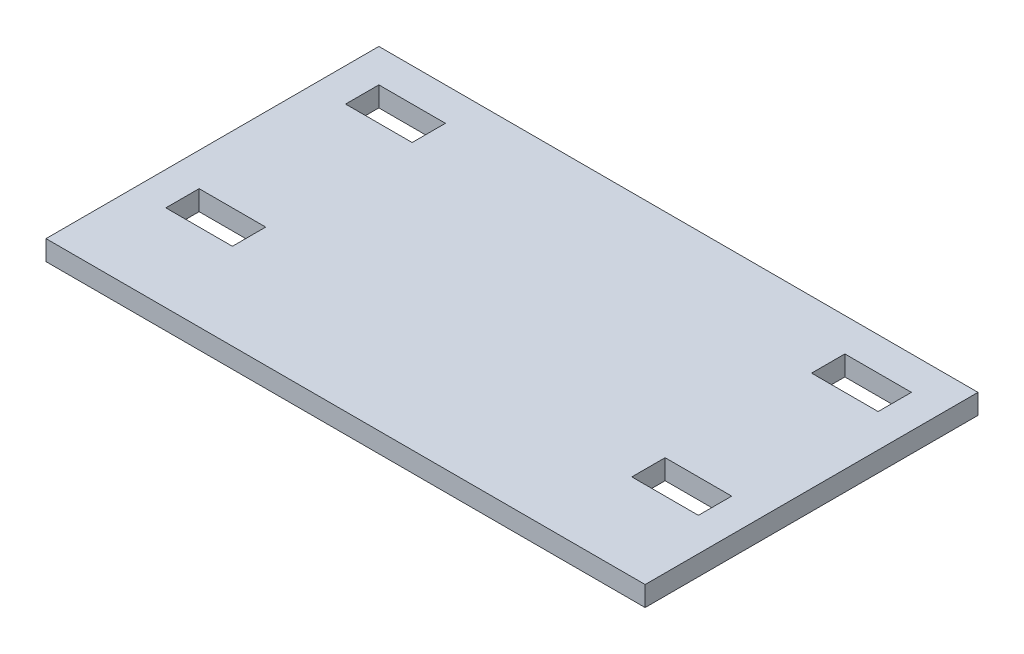
ISO-10303-21;
HEADER;
FILE_DESCRIPTION(('STEP AP214'),'2;1');
FILE_NAME('part.step','',(''),(''),'','','');
FILE_SCHEMA(('AUTOMOTIVE_DESIGN { 1 0 10303 214 1 1 1 1 }'));
ENDSEC;
DATA;
#1=APPLICATION_CONTEXT('core data for automotive mechanical design processes');
#2=APPLICATION_PROTOCOL_DEFINITION('international standard','automotive_design',2000,#1);
#3=PRODUCT_CONTEXT('',#1,'mechanical');
#4=PRODUCT('Part','Part','',(#3));
#5=PRODUCT_RELATED_PRODUCT_CATEGORY('part','',(#4));
#6=PRODUCT_DEFINITION_FORMATION('','',#4);
#7=PRODUCT_DEFINITION_CONTEXT('part definition',#1,'design');
#8=PRODUCT_DEFINITION('design','',#6,#7);
#9=PRODUCT_DEFINITION_SHAPE('','',#8);
#10=(LENGTH_UNIT() NAMED_UNIT(*) SI_UNIT(.MILLI.,.METRE.));
#11=(NAMED_UNIT(*) PLANE_ANGLE_UNIT() SI_UNIT($,.RADIAN.));
#12=(NAMED_UNIT(*) SI_UNIT($,.STERADIAN.) SOLID_ANGLE_UNIT());
#13=UNCERTAINTY_MEASURE_WITH_UNIT(LENGTH_MEASURE(1.E-05),#10,'distance_accuracy_value','');
#14=(GEOMETRIC_REPRESENTATION_CONTEXT(3) GLOBAL_UNCERTAINTY_ASSIGNED_CONTEXT((#13)) GLOBAL_UNIT_ASSIGNED_CONTEXT((#10,
#11,#12)) REPRESENTATION_CONTEXT('',''));
#15=CARTESIAN_POINT('',(0.,0.,0.));
#16=DIRECTION('',(0.,0.,1.));
#17=DIRECTION('',(1.,0.,0.));
#18=AXIS2_PLACEMENT_3D('',#15,#16,#17);
#19=CARTESIAN_POINT('',(-45.,3.,25.));
#20=DIRECTION('',(-1.,0.,0.));
#21=DIRECTION('',(0.,0.,1.));
#22=AXIS2_PLACEMENT_3D('',#19,#20,#21);
#23=PLANE('',#22);
#24=DIRECTION('',(0.,0.,-1.));
#25=VECTOR('',#24,1.);
#26=CARTESIAN_POINT('',(-45.,0.,25.));
#27=LINE('',#26,#25);
#28=CARTESIAN_POINT('',(-45.,0.,25.));
#29=VERTEX_POINT('',#28);
#30=CARTESIAN_POINT('',(-45.,0.,-25.));
#31=VERTEX_POINT('',#30);
#32=EDGE_CURVE('E303',#29,#31,#27,.T.);
#33=ORIENTED_EDGE('',*,*,#32,.F.);
#34=DIRECTION('',(0.,-1.,0.));
#35=VECTOR('',#34,1.);
#36=CARTESIAN_POINT('',(-45.,3.,25.));
#37=LINE('',#36,#35);
#38=CARTESIAN_POINT('',(-45.,3.,25.));
#39=VERTEX_POINT('',#38);
#40=EDGE_CURVE('E11',#39,#29,#37,.T.);
#41=ORIENTED_EDGE('',*,*,#40,.F.);
#42=DIRECTION('',(0.,0.,-1.));
#43=VECTOR('',#42,1.);
#44=CARTESIAN_POINT('',(-45.,3.,25.));
#45=LINE('',#44,#43);
#46=CARTESIAN_POINT('',(-45.,3.,-25.));
#47=VERTEX_POINT('',#46);
#48=EDGE_CURVE('E304',#39,#47,#45,.T.);
#49=ORIENTED_EDGE('',*,*,#48,.T.);
#50=DIRECTION('',(0.,-1.,0.));
#51=VECTOR('',#50,1.);
#52=CARTESIAN_POINT('',(-45.,3.,-25.));
#53=LINE('',#52,#51);
#54=EDGE_CURVE('E36',#47,#31,#53,.T.);
#55=ORIENTED_EDGE('',*,*,#54,.T.);
#56=EDGE_LOOP('',(#33,#41,#49,#55));
#57=FACE_BOUND('',#56,.T.);
#58=ADVANCED_FACE('F33',(#57),#23,.T.);
#59=CARTESIAN_POINT('',(-45.,3.,25.));
#60=DIRECTION('',(0.,0.,-1.));
#61=DIRECTION('',(-1.,0.,0.));
#62=AXIS2_PLACEMENT_3D('',#59,#60,#61);
#63=PLANE('',#62);
#64=DIRECTION('',(1.,0.,0.));
#65=VECTOR('',#64,1.);
#66=CARTESIAN_POINT('',(-45.,0.,25.));
#67=LINE('',#66,#65);
#68=CARTESIAN_POINT('',(45.,0.,25.));
#69=VERTEX_POINT('',#68);
#70=EDGE_CURVE('E308',#29,#69,#67,.T.);
#71=ORIENTED_EDGE('',*,*,#70,.T.);
#72=DIRECTION('',(0.,-1.,0.));
#73=VECTOR('',#72,1.);
#74=CARTESIAN_POINT('',(45.,3.,25.));
#75=LINE('',#74,#73);
#76=CARTESIAN_POINT('',(45.,3.,25.));
#77=VERTEX_POINT('',#76);
#78=EDGE_CURVE('E41',#77,#69,#75,.T.);
#79=ORIENTED_EDGE('',*,*,#78,.F.);
#80=DIRECTION('',(1.,0.,0.));
#81=VECTOR('',#80,1.);
#82=CARTESIAN_POINT('',(-45.,3.,25.));
#83=LINE('',#82,#81);
#84=EDGE_CURVE('E313',#39,#77,#83,.T.);
#85=ORIENTED_EDGE('',*,*,#84,.F.);
#86=ORIENTED_EDGE('',*,*,#40,.T.);
#87=EDGE_LOOP('',(#71,#79,#85,#86));
#88=FACE_BOUND('',#87,.T.);
#89=ADVANCED_FACE('F339',(#88),#63,.F.);
#90=CARTESIAN_POINT('',(45.,3.,25.));
#91=DIRECTION('',(-1.,0.,0.));
#92=DIRECTION('',(0.,0.,1.));
#93=AXIS2_PLACEMENT_3D('',#90,#91,#92);
#94=PLANE('',#93);
#95=DIRECTION('',(0.,0.,-1.));
#96=VECTOR('',#95,1.);
#97=CARTESIAN_POINT('',(45.,0.,25.));
#98=LINE('',#97,#96);
#99=CARTESIAN_POINT('',(45.,0.,-25.));
#100=VERTEX_POINT('',#99);
#101=EDGE_CURVE('E320',#69,#100,#98,.T.);
#102=ORIENTED_EDGE('',*,*,#101,.T.);
#103=DIRECTION('',(0.,-1.,0.));
#104=VECTOR('',#103,1.);
#105=CARTESIAN_POINT('',(45.,3.,-25.));
#106=LINE('',#105,#104);
#107=CARTESIAN_POINT('',(45.,3.,-25.));
#108=VERTEX_POINT('',#107);
#109=EDGE_CURVE('E325',#108,#100,#106,.T.);
#110=ORIENTED_EDGE('',*,*,#109,.F.);
#111=DIRECTION('',(0.,0.,-1.));
#112=VECTOR('',#111,1.);
#113=CARTESIAN_POINT('',(45.,3.,25.));
#114=LINE('',#113,#112);
#115=EDGE_CURVE('E311',#77,#108,#114,.T.);
#116=ORIENTED_EDGE('',*,*,#115,.F.);
#117=ORIENTED_EDGE('',*,*,#78,.T.);
#118=EDGE_LOOP('',(#102,#110,#116,#117));
#119=FACE_BOUND('',#118,.T.);
#120=ADVANCED_FACE('F343',(#119),#94,.F.);
#121=CARTESIAN_POINT('',(-45.,3.,-25.));
#122=DIRECTION('',(0.,0.,-1.));
#123=DIRECTION('',(-1.,0.,0.));
#124=AXIS2_PLACEMENT_3D('',#121,#122,#123);
#125=PLANE('',#124);
#126=DIRECTION('',(1.,0.,0.));
#127=VECTOR('',#126,1.);
#128=CARTESIAN_POINT('',(-45.,0.,-25.));
#129=LINE('',#128,#127);
#130=EDGE_CURVE('E317',#31,#100,#129,.T.);
#131=ORIENTED_EDGE('',*,*,#130,.F.);
#132=ORIENTED_EDGE('',*,*,#54,.F.);
#133=DIRECTION('',(1.,0.,0.));
#134=VECTOR('',#133,1.);
#135=CARTESIAN_POINT('',(-45.,3.,-25.));
#136=LINE('',#135,#134);
#137=EDGE_CURVE('E307',#47,#108,#136,.T.);
#138=ORIENTED_EDGE('',*,*,#137,.T.);
#139=ORIENTED_EDGE('',*,*,#109,.T.);
#140=EDGE_LOOP('',(#131,#132,#138,#139));
#141=FACE_BOUND('',#140,.T.);
#142=ADVANCED_FACE('F333',(#141),#125,.T.);
#143=CARTESIAN_POINT('',(0.,3.,0.));
#144=DIRECTION('',(0.,-1.,0.));
#145=DIRECTION('',(0.,0.,-1.));
#146=AXIS2_PLACEMENT_3D('',#143,#144,#145);
#147=PLANE('',#146);
#148=DIRECTION('',(0.,0.,1.));
#149=VECTOR('',#148,1.);
#150=CARTESIAN_POINT('',(30.,3.,-20.));
#151=LINE('',#150,#149);
#152=CARTESIAN_POINT('',(30.,3.,-20.));
#153=VERTEX_POINT('',#152);
#154=CARTESIAN_POINT('',(30.,3.,-15.));
#155=VERTEX_POINT('',#154);
#156=EDGE_CURVE('E194',#153,#155,#151,.T.);
#157=ORIENTED_EDGE('',*,*,#156,.F.);
#158=DIRECTION('',(-1.,0.,0.));
#159=VECTOR('',#158,1.);
#160=CARTESIAN_POINT('',(40.,3.,-20.));
#161=LINE('',#160,#159);
#162=CARTESIAN_POINT('',(40.,3.,-20.));
#163=VERTEX_POINT('',#162);
#164=EDGE_CURVE('E49',#163,#153,#161,.T.);
#165=ORIENTED_EDGE('',*,*,#164,.F.);
#166=DIRECTION('',(0.,0.,-1.));
#167=VECTOR('',#166,1.);
#168=CARTESIAN_POINT('',(40.,3.,-20.));
#169=LINE('',#168,#167);
#170=CARTESIAN_POINT('',(40.,3.,-15.));
#171=VERTEX_POINT('',#170);
#172=EDGE_CURVE('E187',#171,#163,#169,.T.);
#173=ORIENTED_EDGE('',*,*,#172,.F.);
#174=DIRECTION('',(1.,0.,0.));
#175=VECTOR('',#174,1.);
#176=CARTESIAN_POINT('',(40.,3.,-15.));
#177=LINE('',#176,#175);
#178=EDGE_CURVE('E201',#155,#171,#177,.T.);
#179=ORIENTED_EDGE('',*,*,#178,.F.);
#180=EDGE_LOOP('',(#157,#165,#173,#179));
#181=FACE_BOUND('',#180,.T.);
#182=DIRECTION('',(-1.,0.,0.));
#183=VECTOR('',#182,1.);
#184=CARTESIAN_POINT('',(40.,3.,7.));
#185=LINE('',#184,#183);
#186=CARTESIAN_POINT('',(40.,3.,7.));
#187=VERTEX_POINT('',#186);
#188=CARTESIAN_POINT('',(30.,3.,7.));
#189=VERTEX_POINT('',#188);
#190=EDGE_CURVE('E221',#187,#189,#185,.T.);
#191=ORIENTED_EDGE('',*,*,#190,.F.);
#192=DIRECTION('',(0.,0.,-1.));
#193=VECTOR('',#192,1.);
#194=CARTESIAN_POINT('',(40.,3.,12.));
#195=LINE('',#194,#193);
#196=CARTESIAN_POINT('',(40.,3.,12.));
#197=VERTEX_POINT('',#196);
#198=EDGE_CURVE('E57',#197,#187,#195,.T.);
#199=ORIENTED_EDGE('',*,*,#198,.F.);
#200=DIRECTION('',(1.,0.,0.));
#201=VECTOR('',#200,1.);
#202=CARTESIAN_POINT('',(40.,3.,12.));
#203=LINE('',#202,#201);
#204=CARTESIAN_POINT('',(30.,3.,12.));
#205=VERTEX_POINT('',#204);
#206=EDGE_CURVE('E227',#205,#197,#203,.T.);
#207=ORIENTED_EDGE('',*,*,#206,.F.);
#208=DIRECTION('',(0.,0.,1.));
#209=VECTOR('',#208,1.);
#210=CARTESIAN_POINT('',(30.,3.,12.));
#211=LINE('',#210,#209);
#212=EDGE_CURVE('E224',#189,#205,#211,.T.);
#213=ORIENTED_EDGE('',*,*,#212,.F.);
#214=EDGE_LOOP('',(#191,#199,#207,#213));
#215=FACE_BOUND('',#214,.T.);
#216=DIRECTION('',(0.,0.,-1.));
#217=VECTOR('',#216,1.);
#218=CARTESIAN_POINT('',(-30.,3.,12.));
#219=LINE('',#218,#217);
#220=CARTESIAN_POINT('',(-30.,3.,12.));
#221=VERTEX_POINT('',#220);
#222=CARTESIAN_POINT('',(-30.,3.,7.));
#223=VERTEX_POINT('',#222);
#224=EDGE_CURVE('E252',#221,#223,#219,.T.);
#225=ORIENTED_EDGE('',*,*,#224,.F.);
#226=DIRECTION('',(1.,0.,0.));
#227=VECTOR('',#226,1.);
#228=CARTESIAN_POINT('',(-40.,3.,12.));
#229=LINE('',#228,#227);
#230=CARTESIAN_POINT('',(-40.,3.,12.));
#231=VERTEX_POINT('',#230);
#232=EDGE_CURVE('E250',#231,#221,#229,.T.);
#233=ORIENTED_EDGE('',*,*,#232,.F.);
#234=DIRECTION('',(0.,0.,1.));
#235=VECTOR('',#234,1.);
#236=CARTESIAN_POINT('',(-40.,3.,12.));
#237=LINE('',#236,#235);
#238=CARTESIAN_POINT('',(-40.,3.,7.));
#239=VERTEX_POINT('',#238);
#240=EDGE_CURVE('E258',#239,#231,#237,.T.);
#241=ORIENTED_EDGE('',*,*,#240,.F.);
#242=DIRECTION('',(-1.,0.,0.));
#243=VECTOR('',#242,1.);
#244=CARTESIAN_POINT('',(-40.,3.,7.));
#245=LINE('',#244,#243);
#246=EDGE_CURVE('E255',#223,#239,#245,.T.);
#247=ORIENTED_EDGE('',*,*,#246,.F.);
#248=EDGE_LOOP('',(#225,#233,#241,#247));
#249=FACE_BOUND('',#248,.T.);
#250=DIRECTION('',(1.,0.,0.));
#251=VECTOR('',#250,1.);
#252=CARTESIAN_POINT('',(-40.,3.,-15.));
#253=LINE('',#252,#251);
#254=CARTESIAN_POINT('',(-40.,3.,-15.));
#255=VERTEX_POINT('',#254);
#256=CARTESIAN_POINT('',(-30.,3.,-15.));
#257=VERTEX_POINT('',#256);
#258=EDGE_CURVE('E282',#255,#257,#253,.T.);
#259=ORIENTED_EDGE('',*,*,#258,.F.);
#260=DIRECTION('',(0.,0.,1.));
#261=VECTOR('',#260,1.);
#262=CARTESIAN_POINT('',(-40.,3.,-20.));
#263=LINE('',#262,#261);
#264=CARTESIAN_POINT('',(-40.,3.,-20.));
#265=VERTEX_POINT('',#264);
#266=EDGE_CURVE('E280',#265,#255,#263,.T.);
#267=ORIENTED_EDGE('',*,*,#266,.F.);
#268=DIRECTION('',(-1.,0.,0.));
#269=VECTOR('',#268,1.);
#270=CARTESIAN_POINT('',(-40.,3.,-20.));
#271=LINE('',#270,#269);
#272=CARTESIAN_POINT('',(-30.,3.,-20.));
#273=VERTEX_POINT('',#272);
#274=EDGE_CURVE('E288',#273,#265,#271,.T.);
#275=ORIENTED_EDGE('',*,*,#274,.F.);
#276=DIRECTION('',(0.,0.,-1.));
#277=VECTOR('',#276,1.);
#278=CARTESIAN_POINT('',(-30.,3.,-20.));
#279=LINE('',#278,#277);
#280=EDGE_CURVE('E285',#257,#273,#279,.T.);
#281=ORIENTED_EDGE('',*,*,#280,.F.);
#282=EDGE_LOOP('',(#259,#267,#275,#281));
#283=FACE_BOUND('',#282,.T.);
#284=ORIENTED_EDGE('',*,*,#48,.F.);
#285=ORIENTED_EDGE('',*,*,#84,.T.);
#286=ORIENTED_EDGE('',*,*,#115,.T.);
#287=ORIENTED_EDGE('',*,*,#137,.F.);
#288=EDGE_LOOP('',(#284,#285,#286,#287));
#289=FACE_BOUND('',#288,.T.);
#290=ADVANCED_FACE('F345',(#181,#215,#249,#283,#289),#147,.F.);
#291=CARTESIAN_POINT('',(0.,0.,0.));
#292=DIRECTION('',(0.,-1.,0.));
#293=DIRECTION('',(0.,0.,-1.));
#294=AXIS2_PLACEMENT_3D('',#291,#292,#293);
#295=PLANE('',#294);
#296=DIRECTION('',(-1.,0.,0.));
#297=VECTOR('',#296,1.);
#298=CARTESIAN_POINT('',(40.,0.,-20.));
#299=LINE('',#298,#297);
#300=CARTESIAN_POINT('',(40.,0.,-20.));
#301=VERTEX_POINT('',#300);
#302=CARTESIAN_POINT('',(30.,0.,-20.));
#303=VERTEX_POINT('',#302);
#304=EDGE_CURVE('E185',#301,#303,#299,.T.);
#305=ORIENTED_EDGE('',*,*,#304,.T.);
#306=DIRECTION('',(0.,0.,1.));
#307=VECTOR('',#306,1.);
#308=CARTESIAN_POINT('',(30.,0.,-20.));
#309=LINE('',#308,#307);
#310=CARTESIAN_POINT('',(30.,0.,-15.));
#311=VERTEX_POINT('',#310);
#312=EDGE_CURVE('E171',#303,#311,#309,.T.);
#313=ORIENTED_EDGE('',*,*,#312,.T.);
#314=DIRECTION('',(1.,0.,0.));
#315=VECTOR('',#314,1.);
#316=CARTESIAN_POINT('',(40.,0.,-15.));
#317=LINE('',#316,#315);
#318=CARTESIAN_POINT('',(40.,0.,-15.));
#319=VERTEX_POINT('',#318);
#320=EDGE_CURVE('E196',#311,#319,#317,.T.);
#321=ORIENTED_EDGE('',*,*,#320,.T.);
#322=DIRECTION('',(0.,0.,-1.));
#323=VECTOR('',#322,1.);
#324=CARTESIAN_POINT('',(40.,0.,-20.));
#325=LINE('',#324,#323);
#326=EDGE_CURVE('E192',#319,#301,#325,.T.);
#327=ORIENTED_EDGE('',*,*,#326,.T.);
#328=EDGE_LOOP('',(#305,#313,#321,#327));
#329=FACE_BOUND('',#328,.T.);
#330=DIRECTION('',(0.,0.,-1.));
#331=VECTOR('',#330,1.);
#332=CARTESIAN_POINT('',(40.,0.,12.));
#333=LINE('',#332,#331);
#334=CARTESIAN_POINT('',(40.,0.,12.));
#335=VERTEX_POINT('',#334);
#336=CARTESIAN_POINT('',(40.,0.,7.));
#337=VERTEX_POINT('',#336);
#338=EDGE_CURVE('E217',#335,#337,#333,.T.);
#339=ORIENTED_EDGE('',*,*,#338,.T.);
#340=DIRECTION('',(-1.,0.,0.));
#341=VECTOR('',#340,1.);
#342=CARTESIAN_POINT('',(40.,0.,7.));
#343=LINE('',#342,#341);
#344=CARTESIAN_POINT('',(30.,0.,7.));
#345=VERTEX_POINT('',#344);
#346=EDGE_CURVE('E233',#337,#345,#343,.T.);
#347=ORIENTED_EDGE('',*,*,#346,.T.);
#348=DIRECTION('',(0.,0.,1.));
#349=VECTOR('',#348,1.);
#350=CARTESIAN_POINT('',(30.,0.,12.));
#351=LINE('',#350,#349);
#352=CARTESIAN_POINT('',(30.,0.,12.));
#353=VERTEX_POINT('',#352);
#354=EDGE_CURVE('E210',#345,#353,#351,.T.);
#355=ORIENTED_EDGE('',*,*,#354,.T.);
#356=DIRECTION('',(1.,0.,0.));
#357=VECTOR('',#356,1.);
#358=CARTESIAN_POINT('',(40.,0.,12.));
#359=LINE('',#358,#357);
#360=EDGE_CURVE('E213',#353,#335,#359,.T.);
#361=ORIENTED_EDGE('',*,*,#360,.T.);
#362=EDGE_LOOP('',(#339,#347,#355,#361));
#363=FACE_BOUND('',#362,.T.);
#364=DIRECTION('',(1.,0.,0.));
#365=VECTOR('',#364,1.);
#366=CARTESIAN_POINT('',(-40.,0.,12.));
#367=LINE('',#366,#365);
#368=CARTESIAN_POINT('',(-40.,0.,12.));
#369=VERTEX_POINT('',#368);
#370=CARTESIAN_POINT('',(-30.,0.,12.));
#371=VERTEX_POINT('',#370);
#372=EDGE_CURVE('E247',#369,#371,#367,.T.);
#373=ORIENTED_EDGE('',*,*,#372,.T.);
#374=DIRECTION('',(0.,0.,-1.));
#375=VECTOR('',#374,1.);
#376=CARTESIAN_POINT('',(-30.,0.,12.));
#377=LINE('',#376,#375);
#378=CARTESIAN_POINT('',(-30.,0.,7.));
#379=VERTEX_POINT('',#378);
#380=EDGE_CURVE('E214',#371,#379,#377,.T.);
#381=ORIENTED_EDGE('',*,*,#380,.T.);
#382=DIRECTION('',(-1.,0.,0.));
#383=VECTOR('',#382,1.);
#384=CARTESIAN_POINT('',(-40.,0.,7.));
#385=LINE('',#384,#383);
#386=CARTESIAN_POINT('',(-40.,0.,7.));
#387=VERTEX_POINT('',#386);
#388=EDGE_CURVE('E241',#379,#387,#385,.T.);
#389=ORIENTED_EDGE('',*,*,#388,.T.);
#390=DIRECTION('',(0.,0.,1.));
#391=VECTOR('',#390,1.);
#392=CARTESIAN_POINT('',(-40.,0.,12.));
#393=LINE('',#392,#391);
#394=EDGE_CURVE('E244',#387,#369,#393,.T.);
#395=ORIENTED_EDGE('',*,*,#394,.T.);
#396=EDGE_LOOP('',(#373,#381,#389,#395));
#397=FACE_BOUND('',#396,.T.);
#398=DIRECTION('',(0.,0.,1.));
#399=VECTOR('',#398,1.);
#400=CARTESIAN_POINT('',(-40.,0.,-20.));
#401=LINE('',#400,#399);
#402=CARTESIAN_POINT('',(-40.,0.,-20.));
#403=VERTEX_POINT('',#402);
#404=CARTESIAN_POINT('',(-40.,0.,-15.));
#405=VERTEX_POINT('',#404);
#406=EDGE_CURVE('E277',#403,#405,#401,.T.);
#407=ORIENTED_EDGE('',*,*,#406,.T.);
#408=DIRECTION('',(1.,0.,0.));
#409=VECTOR('',#408,1.);
#410=CARTESIAN_POINT('',(-40.,0.,-15.));
#411=LINE('',#410,#409);
#412=CARTESIAN_POINT('',(-30.,0.,-15.));
#413=VERTEX_POINT('',#412);
#414=EDGE_CURVE('E294',#405,#413,#411,.T.);
#415=ORIENTED_EDGE('',*,*,#414,.T.);
#416=DIRECTION('',(0.,0.,-1.));
#417=VECTOR('',#416,1.);
#418=CARTESIAN_POINT('',(-30.,0.,-20.));
#419=LINE('',#418,#417);
#420=CARTESIAN_POINT('',(-30.,0.,-20.));
#421=VERTEX_POINT('',#420);
#422=EDGE_CURVE('E181',#413,#421,#419,.T.);
#423=ORIENTED_EDGE('',*,*,#422,.T.);
#424=DIRECTION('',(-1.,0.,0.));
#425=VECTOR('',#424,1.);
#426=CARTESIAN_POINT('',(-40.,0.,-20.));
#427=LINE('',#426,#425);
#428=EDGE_CURVE('E274',#421,#403,#427,.T.);
#429=ORIENTED_EDGE('',*,*,#428,.T.);
#430=EDGE_LOOP('',(#407,#415,#423,#429));
#431=FACE_BOUND('',#430,.T.);
#432=ORIENTED_EDGE('',*,*,#32,.T.);
#433=ORIENTED_EDGE('',*,*,#130,.T.);
#434=ORIENTED_EDGE('',*,*,#101,.F.);
#435=ORIENTED_EDGE('',*,*,#70,.F.);
#436=EDGE_LOOP('',(#432,#433,#434,#435));
#437=FACE_BOUND('',#436,.T.);
#438=ADVANCED_FACE('F190',(#329,#363,#397,#431,#437),#295,.T.);
#439=CARTESIAN_POINT('',(-40.,-0.00100000000000013,-20.));
#440=DIRECTION('',(-1.,0.,0.));
#441=DIRECTION('',(0.,0.,1.));
#442=AXIS2_PLACEMENT_3D('',#439,#440,#441);
#443=PLANE('',#442);
#444=DIRECTION('',(0.,1.,0.));
#445=VECTOR('',#444,1.);
#446=CARTESIAN_POINT('',(-40.,-0.00100000000000013,-20.));
#447=LINE('',#446,#445);
#448=EDGE_CURVE('E292',#403,#265,#447,.T.);
#449=ORIENTED_EDGE('',*,*,#448,.T.);
#450=ORIENTED_EDGE('',*,*,#266,.T.);
#451=DIRECTION('',(0.,1.,0.));
#452=VECTOR('',#451,1.);
#453=CARTESIAN_POINT('',(-40.,-0.00100000000000013,-15.));
#454=LINE('',#453,#452);
#455=EDGE_CURVE('E291',#405,#255,#454,.T.);
#456=ORIENTED_EDGE('',*,*,#455,.F.);
#457=ORIENTED_EDGE('',*,*,#406,.F.);
#458=EDGE_LOOP('',(#449,#450,#456,#457));
#459=FACE_BOUND('',#458,.T.);
#460=ADVANCED_FACE('F353',(#459),#443,.F.);
#461=CARTESIAN_POINT('',(-40.,-0.00100000000000013,-20.));
#462=DIRECTION('',(0.,0.,-1.));
#463=DIRECTION('',(-1.,0.,0.));
#464=AXIS2_PLACEMENT_3D('',#461,#462,#463);
#465=PLANE('',#464);
#466=DIRECTION('',(0.,1.,0.));
#467=VECTOR('',#466,1.);
#468=CARTESIAN_POINT('',(-30.,-0.00100000000000013,-20.));
#469=LINE('',#468,#467);
#470=EDGE_CURVE('E295',#421,#273,#469,.T.);
#471=ORIENTED_EDGE('',*,*,#470,.T.);
#472=ORIENTED_EDGE('',*,*,#274,.T.);
#473=ORIENTED_EDGE('',*,*,#448,.F.);
#474=ORIENTED_EDGE('',*,*,#428,.F.);
#475=EDGE_LOOP('',(#471,#472,#473,#474));
#476=FACE_BOUND('',#475,.T.);
#477=ADVANCED_FACE('F391',(#476),#465,.F.);
#478=CARTESIAN_POINT('',(-30.,-0.00100000000000013,-20.));
#479=DIRECTION('',(1.,0.,0.));
#480=DIRECTION('',(0.,0.,-1.));
#481=AXIS2_PLACEMENT_3D('',#478,#479,#480);
#482=PLANE('',#481);
#483=DIRECTION('',(0.,1.,0.));
#484=VECTOR('',#483,1.);
#485=CARTESIAN_POINT('',(-30.,-0.00100000000000013,-15.));
#486=LINE('',#485,#484);
#487=EDGE_CURVE('E297',#413,#257,#486,.T.);
#488=ORIENTED_EDGE('',*,*,#487,.T.);
#489=ORIENTED_EDGE('',*,*,#280,.T.);
#490=ORIENTED_EDGE('',*,*,#470,.F.);
#491=ORIENTED_EDGE('',*,*,#422,.F.);
#492=EDGE_LOOP('',(#488,#489,#490,#491));
#493=FACE_BOUND('',#492,.T.);
#494=ADVANCED_FACE('F400',(#493),#482,.F.);
#495=CARTESIAN_POINT('',(-40.,-0.00100000000000013,-15.));
#496=DIRECTION('',(0.,0.,1.));
#497=DIRECTION('',(1.,0.,0.));
#498=AXIS2_PLACEMENT_3D('',#495,#496,#497);
#499=PLANE('',#498);
#500=ORIENTED_EDGE('',*,*,#455,.T.);
#501=ORIENTED_EDGE('',*,*,#258,.T.);
#502=ORIENTED_EDGE('',*,*,#487,.F.);
#503=ORIENTED_EDGE('',*,*,#414,.F.);
#504=EDGE_LOOP('',(#500,#501,#502,#503));
#505=FACE_BOUND('',#504,.T.);
#506=ADVANCED_FACE('F410',(#505),#499,.F.);
#507=CARTESIAN_POINT('',(-40.,-0.00100000000000013,12.));
#508=DIRECTION('',(0.,0.,1.));
#509=DIRECTION('',(1.,0.,0.));
#510=AXIS2_PLACEMENT_3D('',#507,#508,#509);
#511=PLANE('',#510);
#512=DIRECTION('',(0.,1.,0.));
#513=VECTOR('',#512,1.);
#514=CARTESIAN_POINT('',(-40.,-0.00100000000000013,12.));
#515=LINE('',#514,#513);
#516=EDGE_CURVE('E262',#369,#231,#515,.T.);
#517=ORIENTED_EDGE('',*,*,#516,.T.);
#518=ORIENTED_EDGE('',*,*,#232,.T.);
#519=DIRECTION('',(0.,1.,0.));
#520=VECTOR('',#519,1.);
#521=CARTESIAN_POINT('',(-30.,-0.00100000000000013,12.));
#522=LINE('',#521,#520);
#523=EDGE_CURVE('E261',#371,#221,#522,.T.);
#524=ORIENTED_EDGE('',*,*,#523,.F.);
#525=ORIENTED_EDGE('',*,*,#372,.F.);
#526=EDGE_LOOP('',(#517,#518,#524,#525));
#527=FACE_BOUND('',#526,.T.);
#528=ADVANCED_FACE('F420',(#527),#511,.F.);
#529=CARTESIAN_POINT('',(-40.,-0.00100000000000013,12.));
#530=DIRECTION('',(-1.,0.,0.));
#531=DIRECTION('',(0.,0.,1.));
#532=AXIS2_PLACEMENT_3D('',#529,#530,#531);
#533=PLANE('',#532);
#534=DIRECTION('',(0.,1.,0.));
#535=VECTOR('',#534,1.);
#536=CARTESIAN_POINT('',(-40.,-0.00100000000000013,7.));
#537=LINE('',#536,#535);
#538=EDGE_CURVE('E264',#387,#239,#537,.T.);
#539=ORIENTED_EDGE('',*,*,#538,.T.);
#540=ORIENTED_EDGE('',*,*,#240,.T.);
#541=ORIENTED_EDGE('',*,*,#516,.F.);
#542=ORIENTED_EDGE('',*,*,#394,.F.);
#543=EDGE_LOOP('',(#539,#540,#541,#542));
#544=FACE_BOUND('',#543,.T.);
#545=ADVANCED_FACE('F430',(#544),#533,.F.);
#546=CARTESIAN_POINT('',(-40.,-0.00100000000000013,7.));
#547=DIRECTION('',(0.,0.,-1.));
#548=DIRECTION('',(-1.,0.,0.));
#549=AXIS2_PLACEMENT_3D('',#546,#547,#548);
#550=PLANE('',#549);
#551=DIRECTION('',(0.,1.,0.));
#552=VECTOR('',#551,1.);
#553=CARTESIAN_POINT('',(-30.,-0.00100000000000013,7.));
#554=LINE('',#553,#552);
#555=EDGE_CURVE('E266',#379,#223,#554,.T.);
#556=ORIENTED_EDGE('',*,*,#555,.T.);
#557=ORIENTED_EDGE('',*,*,#246,.T.);
#558=ORIENTED_EDGE('',*,*,#538,.F.);
#559=ORIENTED_EDGE('',*,*,#388,.F.);
#560=EDGE_LOOP('',(#556,#557,#558,#559));
#561=FACE_BOUND('',#560,.T.);
#562=ADVANCED_FACE('F440',(#561),#550,.F.);
#563=CARTESIAN_POINT('',(-30.,-0.00100000000000013,12.));
#564=DIRECTION('',(1.,0.,0.));
#565=DIRECTION('',(0.,0.,-1.));
#566=AXIS2_PLACEMENT_3D('',#563,#564,#565);
#567=PLANE('',#566);
#568=ORIENTED_EDGE('',*,*,#523,.T.);
#569=ORIENTED_EDGE('',*,*,#224,.T.);
#570=ORIENTED_EDGE('',*,*,#555,.F.);
#571=ORIENTED_EDGE('',*,*,#380,.F.);
#572=EDGE_LOOP('',(#568,#569,#570,#571));
#573=FACE_BOUND('',#572,.T.);
#574=ADVANCED_FACE('F450',(#573),#567,.F.);
#575=CARTESIAN_POINT('',(40.,-0.00100000000000013,12.));
#576=DIRECTION('',(1.,0.,0.));
#577=DIRECTION('',(0.,0.,-1.));
#578=AXIS2_PLACEMENT_3D('',#575,#576,#577);
#579=PLANE('',#578);
#580=DIRECTION('',(0.,1.,0.));
#581=VECTOR('',#580,1.);
#582=CARTESIAN_POINT('',(40.,-0.00100000000000013,12.));
#583=LINE('',#582,#581);
#584=EDGE_CURVE('E231',#335,#197,#583,.T.);
#585=ORIENTED_EDGE('',*,*,#584,.T.);
#586=ORIENTED_EDGE('',*,*,#198,.T.);
#587=DIRECTION('',(0.,1.,0.));
#588=VECTOR('',#587,1.);
#589=CARTESIAN_POINT('',(40.,-0.00100000000000013,7.));
#590=LINE('',#589,#588);
#591=EDGE_CURVE('E230',#337,#187,#590,.T.);
#592=ORIENTED_EDGE('',*,*,#591,.F.);
#593=ORIENTED_EDGE('',*,*,#338,.F.);
#594=EDGE_LOOP('',(#585,#586,#592,#593));
#595=FACE_BOUND('',#594,.T.);
#596=ADVANCED_FACE('F460',(#595),#579,.F.);
#597=CARTESIAN_POINT('',(40.,-0.00100000000000013,12.));
#598=DIRECTION('',(0.,0.,1.));
#599=DIRECTION('',(1.,0.,0.));
#600=AXIS2_PLACEMENT_3D('',#597,#598,#599);
#601=PLANE('',#600);
#602=DIRECTION('',(0.,1.,0.));
#603=VECTOR('',#602,1.);
#604=CARTESIAN_POINT('',(30.,-0.00100000000000013,12.));
#605=LINE('',#604,#603);
#606=EDGE_CURVE('E234',#353,#205,#605,.T.);
#607=ORIENTED_EDGE('',*,*,#606,.T.);
#608=ORIENTED_EDGE('',*,*,#206,.T.);
#609=ORIENTED_EDGE('',*,*,#584,.F.);
#610=ORIENTED_EDGE('',*,*,#360,.F.);
#611=EDGE_LOOP('',(#607,#608,#609,#610));
#612=FACE_BOUND('',#611,.T.);
#613=ADVANCED_FACE('F470',(#612),#601,.F.);
#614=CARTESIAN_POINT('',(30.,-0.00100000000000013,12.));
#615=DIRECTION('',(-1.,0.,0.));
#616=DIRECTION('',(0.,0.,1.));
#617=AXIS2_PLACEMENT_3D('',#614,#615,#616);
#618=PLANE('',#617);
#619=DIRECTION('',(0.,1.,0.));
#620=VECTOR('',#619,1.);
#621=CARTESIAN_POINT('',(30.,-0.00100000000000013,7.));
#622=LINE('',#621,#620);
#623=EDGE_CURVE('E236',#345,#189,#622,.T.);
#624=ORIENTED_EDGE('',*,*,#623,.T.);
#625=ORIENTED_EDGE('',*,*,#212,.T.);
#626=ORIENTED_EDGE('',*,*,#606,.F.);
#627=ORIENTED_EDGE('',*,*,#354,.F.);
#628=EDGE_LOOP('',(#624,#625,#626,#627));
#629=FACE_BOUND('',#628,.T.);
#630=ADVANCED_FACE('F479',(#629),#618,.F.);
#631=CARTESIAN_POINT('',(40.,-0.00100000000000013,7.));
#632=DIRECTION('',(0.,0.,-1.));
#633=DIRECTION('',(-1.,0.,0.));
#634=AXIS2_PLACEMENT_3D('',#631,#632,#633);
#635=PLANE('',#634);
#636=ORIENTED_EDGE('',*,*,#591,.T.);
#637=ORIENTED_EDGE('',*,*,#190,.T.);
#638=ORIENTED_EDGE('',*,*,#623,.F.);
#639=ORIENTED_EDGE('',*,*,#346,.F.);
#640=EDGE_LOOP('',(#636,#637,#638,#639));
#641=FACE_BOUND('',#640,.T.);
#642=ADVANCED_FACE('F489',(#641),#635,.F.);
#643=CARTESIAN_POINT('',(40.,-0.00100000000000013,-20.));
#644=DIRECTION('',(0.,0.,-1.));
#645=DIRECTION('',(-1.,0.,0.));
#646=AXIS2_PLACEMENT_3D('',#643,#644,#645);
#647=PLANE('',#646);
#648=DIRECTION('',(0.,1.,0.));
#649=VECTOR('',#648,1.);
#650=CARTESIAN_POINT('',(40.,-0.00100000000000013,-20.));
#651=LINE('',#650,#649);
#652=EDGE_CURVE('E182',#301,#163,#651,.T.);
#653=ORIENTED_EDGE('',*,*,#652,.T.);
#654=ORIENTED_EDGE('',*,*,#164,.T.);
#655=DIRECTION('',(0.,1.,0.));
#656=VECTOR('',#655,1.);
#657=CARTESIAN_POINT('',(30.,-0.00100000000000013,-20.));
#658=LINE('',#657,#656);
#659=EDGE_CURVE('E174',#303,#153,#658,.T.);
#660=ORIENTED_EDGE('',*,*,#659,.F.);
#661=ORIENTED_EDGE('',*,*,#304,.F.);
#662=EDGE_LOOP('',(#653,#654,#660,#661));
#663=FACE_BOUND('',#662,.T.);
#664=ADVANCED_FACE('F184',(#663),#647,.F.);
#665=CARTESIAN_POINT('',(40.,-0.00100000000000013,-20.));
#666=DIRECTION('',(1.,0.,0.));
#667=DIRECTION('',(0.,0.,-1.));
#668=AXIS2_PLACEMENT_3D('',#665,#666,#667);
#669=PLANE('',#668);
#670=DIRECTION('',(0.,1.,0.));
#671=VECTOR('',#670,1.);
#672=CARTESIAN_POINT('',(40.,-0.00100000000000013,-15.));
#673=LINE('',#672,#671);
#674=EDGE_CURVE('E207',#319,#171,#673,.T.);
#675=ORIENTED_EDGE('',*,*,#674,.T.);
#676=ORIENTED_EDGE('',*,*,#172,.T.);
#677=ORIENTED_EDGE('',*,*,#652,.F.);
#678=ORIENTED_EDGE('',*,*,#326,.F.);
#679=EDGE_LOOP('',(#675,#676,#677,#678));
#680=FACE_BOUND('',#679,.T.);
#681=ADVANCED_FACE('F508',(#680),#669,.F.);
#682=CARTESIAN_POINT('',(40.,-0.00100000000000013,-15.));
#683=DIRECTION('',(0.,0.,1.));
#684=DIRECTION('',(1.,0.,0.));
#685=AXIS2_PLACEMENT_3D('',#682,#683,#684);
#686=PLANE('',#685);
#687=DIRECTION('',(0.,1.,0.));
#688=VECTOR('',#687,1.);
#689=CARTESIAN_POINT('',(30.,-0.00100000000000013,-15.));
#690=LINE('',#689,#688);
#691=EDGE_CURVE('E176',#311,#155,#690,.T.);
#692=ORIENTED_EDGE('',*,*,#691,.T.);
#693=ORIENTED_EDGE('',*,*,#178,.T.);
#694=ORIENTED_EDGE('',*,*,#674,.F.);
#695=ORIENTED_EDGE('',*,*,#320,.F.);
#696=EDGE_LOOP('',(#692,#693,#694,#695));
#697=FACE_BOUND('',#696,.T.);
#698=ADVANCED_FACE('F517',(#697),#686,.F.);
#699=CARTESIAN_POINT('',(30.,-0.00100000000000013,-20.));
#700=DIRECTION('',(-1.,0.,0.));
#701=DIRECTION('',(0.,0.,1.));
#702=AXIS2_PLACEMENT_3D('',#699,#700,#701);
#703=PLANE('',#702);
#704=ORIENTED_EDGE('',*,*,#659,.T.);
#705=ORIENTED_EDGE('',*,*,#156,.T.);
#706=ORIENTED_EDGE('',*,*,#691,.F.);
#707=ORIENTED_EDGE('',*,*,#312,.F.);
#708=EDGE_LOOP('',(#704,#705,#706,#707));
#709=FACE_BOUND('',#708,.T.);
#710=ADVANCED_FACE('F172',(#709),#703,.F.);
#711=CLOSED_SHELL('',(#58,#89,#120,#142,#290,#438,#460,#477,#494,#506,#528,#545,#562,#574,#596,
#613,#630,#642,#664,#681,#698,#710));
#712=MANIFOLD_SOLID_BREP('B2',#711);
#713=ADVANCED_BREP_SHAPE_REPRESENTATION('',(#18,#712),#14);
#714=SHAPE_DEFINITION_REPRESENTATION(#9,#713);
ENDSEC;
END-ISO-10303-21;
